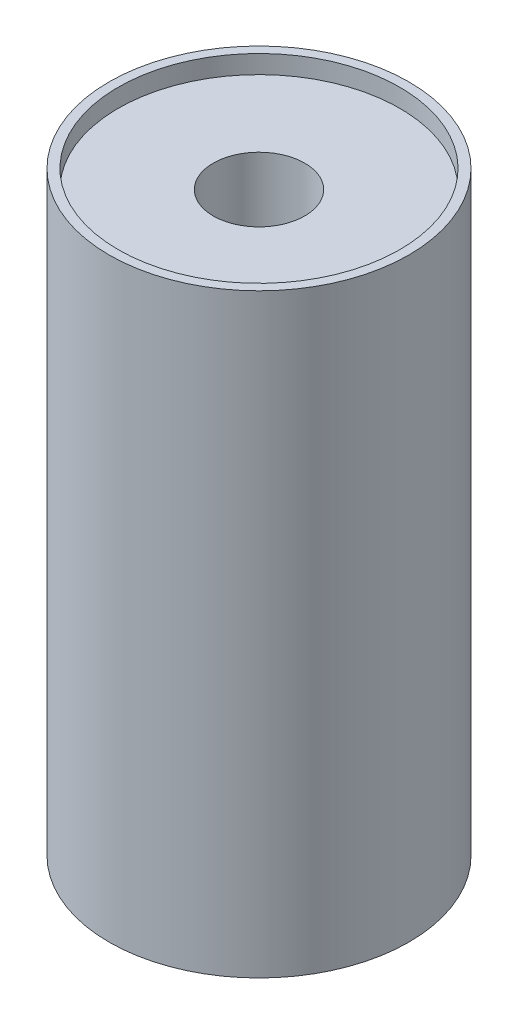
ISO-10303-21;
HEADER;
FILE_DESCRIPTION(('STEP AP214'),'2;1');
FILE_NAME('part.step','',(''),(''),'','','');
FILE_SCHEMA(('AUTOMOTIVE_DESIGN { 1 0 10303 214 1 1 1 1 }'));
ENDSEC;
DATA;
#1=APPLICATION_CONTEXT('core data for automotive mechanical design processes');
#2=APPLICATION_PROTOCOL_DEFINITION('international standard','automotive_design',2000,#1);
#3=PRODUCT_CONTEXT('',#1,'mechanical');
#4=PRODUCT('Part','Part','',(#3));
#5=PRODUCT_RELATED_PRODUCT_CATEGORY('part','',(#4));
#6=PRODUCT_DEFINITION_FORMATION('','',#4);
#7=PRODUCT_DEFINITION_CONTEXT('part definition',#1,'design');
#8=PRODUCT_DEFINITION('design','',#6,#7);
#9=PRODUCT_DEFINITION_SHAPE('','',#8);
#10=(LENGTH_UNIT() NAMED_UNIT(*) SI_UNIT(.MILLI.,.METRE.));
#11=(NAMED_UNIT(*) PLANE_ANGLE_UNIT() SI_UNIT($,.RADIAN.));
#12=(NAMED_UNIT(*) SI_UNIT($,.STERADIAN.) SOLID_ANGLE_UNIT());
#13=UNCERTAINTY_MEASURE_WITH_UNIT(LENGTH_MEASURE(1.E-05),#10,'distance_accuracy_value','');
#14=(GEOMETRIC_REPRESENTATION_CONTEXT(3) GLOBAL_UNCERTAINTY_ASSIGNED_CONTEXT((#13)) GLOBAL_UNIT_ASSIGNED_CONTEXT((#10,
#11,#12)) REPRESENTATION_CONTEXT('',''));
#15=CARTESIAN_POINT('',(0.,0.,0.));
#16=DIRECTION('',(0.,0.,1.));
#17=DIRECTION('',(1.,0.,0.));
#18=AXIS2_PLACEMENT_3D('',#15,#16,#17);
#19=CARTESIAN_POINT('',(0.,0.,0.));
#20=DIRECTION('',(0.,1.,0.));
#21=DIRECTION('',(0.,0.,1.));
#22=AXIS2_PLACEMENT_3D('',#19,#20,#21);
#23=CYLINDRICAL_SURFACE('',#22,12.7);
#24=CARTESIAN_POINT('',(0.,160.02,0.));
#25=DIRECTION('',(0.,1.,0.));
#26=DIRECTION('',(0.,0.,1.));
#27=AXIS2_PLACEMENT_3D('',#24,#25,#26);
#28=CIRCLE('',#27,12.7);
#29=CARTESIAN_POINT('',(0.,160.02,12.7));
#30=VERTEX_POINT('',#29);
#31=EDGE_CURVE('E41',#30,#30,#28,.F.);
#32=ORIENTED_EDGE('',*,*,#31,.F.);
#33=EDGE_LOOP('',(#32));
#34=FACE_BOUND('',#33,.T.);
#35=CARTESIAN_POINT('',(0.,2.54,0.));
#36=DIRECTION('',(0.,-1.,0.));
#37=DIRECTION('',(0.,0.,-1.));
#38=AXIS2_PLACEMENT_3D('',#35,#36,#37);
#39=CIRCLE('',#38,12.7);
#40=CARTESIAN_POINT('',(0.,2.54,-12.7));
#41=VERTEX_POINT('',#40);
#42=EDGE_CURVE('E66',#41,#41,#39,.F.);
#43=ORIENTED_EDGE('',*,*,#42,.F.);
#44=EDGE_LOOP('',(#43));
#45=FACE_BOUND('',#44,.T.);
#46=ADVANCED_FACE('F37',(#34,#45),#23,.F.);
#47=CARTESIAN_POINT('',(0.,165.1,0.));
#48=DIRECTION('',(0.,-1.,0.));
#49=DIRECTION('',(0.,0.,-1.));
#50=AXIS2_PLACEMENT_3D('',#47,#48,#49);
#51=CYLINDRICAL_SURFACE('',#50,41.5925);
#52=CARTESIAN_POINT('',(0.,165.1,0.));
#53=DIRECTION('',(0.,1.,0.));
#54=DIRECTION('',(0.,0.,1.));
#55=AXIS2_PLACEMENT_3D('',#52,#53,#54);
#56=CIRCLE('',#55,41.5925);
#57=CARTESIAN_POINT('',(0.,165.1,41.5925));
#58=VERTEX_POINT('',#57);
#59=EDGE_CURVE('E10',#58,#58,#56,.T.);
#60=ORIENTED_EDGE('',*,*,#59,.F.);
#61=EDGE_LOOP('',(#60));
#62=FACE_BOUND('',#61,.T.);
#63=CARTESIAN_POINT('',(0.,0.,0.));
#64=DIRECTION('',(0.,1.,0.));
#65=DIRECTION('',(0.,0.,1.));
#66=AXIS2_PLACEMENT_3D('',#63,#64,#65);
#67=CIRCLE('',#66,41.5925);
#68=CARTESIAN_POINT('',(0.,0.,41.5925));
#69=VERTEX_POINT('',#68);
#70=EDGE_CURVE('E46',#69,#69,#67,.T.);
#71=ORIENTED_EDGE('',*,*,#70,.T.);
#72=EDGE_LOOP('',(#71));
#73=FACE_BOUND('',#72,.T.);
#74=ADVANCED_FACE('F39',(#62,#73),#51,.T.);
#75=CARTESIAN_POINT('',(0.,165.1,0.));
#76=DIRECTION('',(0.,1.,0.));
#77=DIRECTION('',(0.,0.,1.));
#78=AXIS2_PLACEMENT_3D('',#75,#76,#77);
#79=PLANE('',#78);
#80=CARTESIAN_POINT('',(0.,165.1,0.));
#81=DIRECTION('',(0.,1.,0.));
#82=DIRECTION('',(0.,0.,1.));
#83=AXIS2_PLACEMENT_3D('',#80,#81,#82);
#84=CIRCLE('',#83,39.0525);
#85=CARTESIAN_POINT('',(0.,165.1,39.0525));
#86=VERTEX_POINT('',#85);
#87=EDGE_CURVE('E53',#86,#86,#84,.T.);
#88=ORIENTED_EDGE('',*,*,#87,.F.);
#89=EDGE_LOOP('',(#88));
#90=FACE_BOUND('',#89,.T.);
#91=ORIENTED_EDGE('',*,*,#59,.T.);
#92=EDGE_LOOP('',(#91));
#93=FACE_BOUND('',#92,.T.);
#94=ADVANCED_FACE('F83',(#90,#93),#79,.T.);
#95=CARTESIAN_POINT('',(0.,0.,0.));
#96=DIRECTION('',(0.,1.,0.));
#97=DIRECTION('',(0.,0.,1.));
#98=AXIS2_PLACEMENT_3D('',#95,#96,#97);
#99=PLANE('',#98);
#100=CARTESIAN_POINT('',(0.,0.,0.));
#101=DIRECTION('',(0.,-1.,0.));
#102=DIRECTION('',(0.,0.,-1.));
#103=AXIS2_PLACEMENT_3D('',#100,#101,#102);
#104=CIRCLE('',#103,39.0525);
#105=CARTESIAN_POINT('',(0.,0.,-39.0525));
#106=VERTEX_POINT('',#105);
#107=EDGE_CURVE('E62',#106,#106,#104,.T.);
#108=ORIENTED_EDGE('',*,*,#107,.F.);
#109=EDGE_LOOP('',(#108));
#110=FACE_BOUND('',#109,.T.);
#111=ORIENTED_EDGE('',*,*,#70,.F.);
#112=EDGE_LOOP('',(#111));
#113=FACE_BOUND('',#112,.T.);
#114=ADVANCED_FACE('F91',(#110,#113),#99,.F.);
#115=CARTESIAN_POINT('',(0.,160.02,0.));
#116=DIRECTION('',(0.,1.,0.));
#117=DIRECTION('',(0.,0.,1.));
#118=AXIS2_PLACEMENT_3D('',#115,#116,#117);
#119=PLANE('',#118);
#120=CARTESIAN_POINT('',(0.,160.02,0.));
#121=DIRECTION('',(0.,1.,0.));
#122=DIRECTION('',(0.,0.,1.));
#123=AXIS2_PLACEMENT_3D('',#120,#121,#122);
#124=CIRCLE('',#123,39.0525);
#125=CARTESIAN_POINT('',(0.,160.02,39.0525));
#126=VERTEX_POINT('',#125);
#127=EDGE_CURVE('E57',#126,#126,#124,.T.);
#128=ORIENTED_EDGE('',*,*,#127,.T.);
#129=EDGE_LOOP('',(#128));
#130=FACE_BOUND('',#129,.T.);
#131=ORIENTED_EDGE('',*,*,#31,.T.);
#132=EDGE_LOOP('',(#131));
#133=FACE_BOUND('',#132,.T.);
#134=ADVANCED_FACE('F94',(#130,#133),#119,.T.);
#135=CARTESIAN_POINT('',(0.,160.02,0.));
#136=DIRECTION('',(0.,1.,0.));
#137=DIRECTION('',(0.,0.,1.));
#138=AXIS2_PLACEMENT_3D('',#135,#136,#137);
#139=CYLINDRICAL_SURFACE('',#138,39.0525);
#140=ORIENTED_EDGE('',*,*,#127,.F.);
#141=EDGE_LOOP('',(#140));
#142=FACE_BOUND('',#141,.T.);
#143=ORIENTED_EDGE('',*,*,#87,.T.);
#144=EDGE_LOOP('',(#143));
#145=FACE_BOUND('',#144,.T.);
#146=ADVANCED_FACE('F88',(#142,#145),#139,.F.);
#147=CARTESIAN_POINT('',(0.,2.54,0.));
#148=DIRECTION('',(0.,-1.,0.));
#149=DIRECTION('',(0.,0.,-1.));
#150=AXIS2_PLACEMENT_3D('',#147,#148,#149);
#151=CYLINDRICAL_SURFACE('',#150,39.0525);
#152=CARTESIAN_POINT('',(0.,2.54,0.));
#153=DIRECTION('',(0.,-1.,0.));
#154=DIRECTION('',(0.,0.,-1.));
#155=AXIS2_PLACEMENT_3D('',#152,#153,#154);
#156=CIRCLE('',#155,39.0525);
#157=CARTESIAN_POINT('',(0.,2.54,-39.0525));
#158=VERTEX_POINT('',#157);
#159=EDGE_CURVE('E58',#158,#158,#156,.T.);
#160=ORIENTED_EDGE('',*,*,#159,.F.);
#161=EDGE_LOOP('',(#160));
#162=FACE_BOUND('',#161,.T.);
#163=ORIENTED_EDGE('',*,*,#107,.T.);
#164=EDGE_LOOP('',(#163));
#165=FACE_BOUND('',#164,.T.);
#166=ADVANCED_FACE('F105',(#162,#165),#151,.F.);
#167=CARTESIAN_POINT('',(0.,2.54,0.));
#168=DIRECTION('',(0.,-1.,0.));
#169=DIRECTION('',(0.,0.,-1.));
#170=AXIS2_PLACEMENT_3D('',#167,#168,#169);
#171=PLANE('',#170);
#172=ORIENTED_EDGE('',*,*,#42,.T.);
#173=EDGE_LOOP('',(#172));
#174=FACE_BOUND('',#173,.T.);
#175=ORIENTED_EDGE('',*,*,#159,.T.);
#176=EDGE_LOOP('',(#175));
#177=FACE_BOUND('',#176,.T.);
#178=ADVANCED_FACE('F74',(#174,#177),#171,.T.);
#179=CLOSED_SHELL('',(#46,#74,#94,#114,#134,#146,#166,#178));
#180=MANIFOLD_SOLID_BREP('B2',#179);
#181=ADVANCED_BREP_SHAPE_REPRESENTATION('',(#18,#180),#14);
#182=SHAPE_DEFINITION_REPRESENTATION(#9,#181);
ENDSEC;
END-ISO-10303-21;
